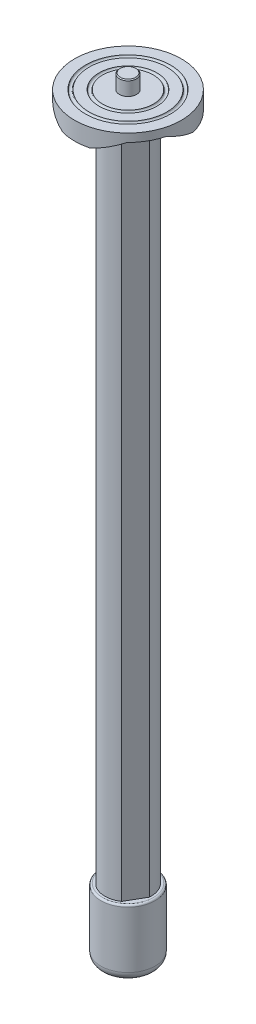
ISO-10303-21;
HEADER;
FILE_DESCRIPTION(('STEP AP214'),'2;1');
FILE_NAME('part.step','',(''),(''),'','','');
FILE_SCHEMA(('AUTOMOTIVE_DESIGN { 1 0 10303 214 1 1 1 1 }'));
ENDSEC;
DATA;
#1=APPLICATION_CONTEXT('core data for automotive mechanical design processes');
#2=APPLICATION_PROTOCOL_DEFINITION('international standard','automotive_design',2000,#1);
#3=PRODUCT_CONTEXT('',#1,'mechanical');
#4=PRODUCT('Part','Part','',(#3));
#5=PRODUCT_RELATED_PRODUCT_CATEGORY('part','',(#4));
#6=PRODUCT_DEFINITION_FORMATION('','',#4);
#7=PRODUCT_DEFINITION_CONTEXT('part definition',#1,'design');
#8=PRODUCT_DEFINITION('design','',#6,#7);
#9=PRODUCT_DEFINITION_SHAPE('','',#8);
#10=(LENGTH_UNIT() NAMED_UNIT(*) SI_UNIT(.MILLI.,.METRE.));
#11=(NAMED_UNIT(*) PLANE_ANGLE_UNIT() SI_UNIT($,.RADIAN.));
#12=(NAMED_UNIT(*) SI_UNIT($,.STERADIAN.) SOLID_ANGLE_UNIT());
#13=UNCERTAINTY_MEASURE_WITH_UNIT(LENGTH_MEASURE(1.E-05),#10,'distance_accuracy_value','');
#14=(GEOMETRIC_REPRESENTATION_CONTEXT(3) GLOBAL_UNCERTAINTY_ASSIGNED_CONTEXT((#13)) GLOBAL_UNIT_ASSIGNED_CONTEXT((#10,
#11,#12)) REPRESENTATION_CONTEXT('',''));
#15=CARTESIAN_POINT('',(0.,0.,0.));
#16=DIRECTION('',(0.,0.,1.));
#17=DIRECTION('',(1.,0.,0.));
#18=AXIS2_PLACEMENT_3D('',#15,#16,#17);
#19=CARTESIAN_POINT('',(0.,193.,0.));
#20=DIRECTION('',(0.,-1.,0.));
#21=DIRECTION('',(0.,0.,-1.));
#22=AXIS2_PLACEMENT_3D('',#19,#20,#21);
#23=CYLINDRICAL_SURFACE('',#22,12.75);
#24=DIRECTION('',(0.,-1.,0.));
#25=VECTOR('',#24,1.);
#26=CARTESIAN_POINT('',(-5.6,193.,-11.4543659798349));
#27=LINE('',#26,#25);
#28=CARTESIAN_POINT('',(-5.6,193.,-11.4543659798349));
#29=VERTEX_POINT('',#28);
#30=CARTESIAN_POINT('',(-5.6,-185.,-11.4543659798349));
#31=VERTEX_POINT('',#30);
#32=EDGE_CURVE('E116',#29,#31,#27,.T.);
#33=ORIENTED_EDGE('',*,*,#32,.T.);
#34=CARTESIAN_POINT('',(0.,-185.,0.));
#35=DIRECTION('',(0.,1.,0.));
#36=DIRECTION('',(0.,0.,1.));
#37=AXIS2_PLACEMENT_3D('',#34,#35,#36);
#38=CIRCLE('',#37,12.75);
#39=CARTESIAN_POINT('',(-12.7197719227813,-185.,0.877440728724495));
#40=VERTEX_POINT('',#39);
#41=EDGE_CURVE('E111',#31,#40,#38,.T.);
#42=ORIENTED_EDGE('',*,*,#41,.T.);
#43=DIRECTION('',(0.,-1.,0.));
#44=VECTOR('',#43,1.);
#45=CARTESIAN_POINT('',(-12.7197719227813,193.,0.877440728724491));
#46=LINE('',#45,#44);
#47=CARTESIAN_POINT('',(-12.7197719227813,193.,0.877440728724491));
#48=VERTEX_POINT('',#47);
#49=EDGE_CURVE('E13',#48,#40,#46,.T.);
#50=ORIENTED_EDGE('',*,*,#49,.F.);
#51=CARTESIAN_POINT('',(0.,193.,0.));
#52=DIRECTION('',(0.,1.,0.));
#53=DIRECTION('',(0.,0.,1.));
#54=AXIS2_PLACEMENT_3D('',#51,#52,#53);
#55=CIRCLE('',#54,12.75);
#56=EDGE_CURVE('E129',#29,#48,#55,.T.);
#57=ORIENTED_EDGE('',*,*,#56,.F.);
#58=EDGE_LOOP('',(#33,#42,#50,#57));
#59=FACE_BOUND('',#58,.T.);
#60=ADVANCED_FACE('F47',(#59),#23,.T.);
#61=CARTESIAN_POINT('',(-12.7197719227813,193.,0.877440728724491));
#62=DIRECTION('',(0.866025403784443,0.,-0.499999999999992));
#63=DIRECTION('',(-0.499999999999992,0.,-0.866025403784443));
#64=AXIS2_PLACEMENT_3D('',#61,#62,#63);
#65=PLANE('',#64);
#66=ORIENTED_EDGE('',*,*,#49,.T.);
#67=DIRECTION('',(0.499999999999992,0.,0.866025403784443));
#68=VECTOR('',#67,1.);
#69=CARTESIAN_POINT('',(-7.11977192278139,-185.,10.5769252511103));
#70=LINE('',#69,#68);
#71=CARTESIAN_POINT('',(-7.11977192278139,-185.,10.5769252511103));
#72=VERTEX_POINT('',#71);
#73=EDGE_CURVE('E101',#40,#72,#70,.T.);
#74=ORIENTED_EDGE('',*,*,#73,.T.);
#75=DIRECTION('',(0.,-1.,0.));
#76=VECTOR('',#75,1.);
#77=CARTESIAN_POINT('',(-7.11977192278139,193.,10.5769252511103));
#78=LINE('',#77,#76);
#79=CARTESIAN_POINT('',(-7.11977192278139,193.,10.5769252511103));
#80=VERTEX_POINT('',#79);
#81=EDGE_CURVE('E54',#80,#72,#78,.T.);
#82=ORIENTED_EDGE('',*,*,#81,.F.);
#83=DIRECTION('',(0.499999999999992,0.,0.866025403784443));
#84=VECTOR('',#83,1.);
#85=CARTESIAN_POINT('',(-12.7197719227813,193.,0.877440728724491));
#86=LINE('',#85,#84);
#87=EDGE_CURVE('E103',#48,#80,#86,.T.);
#88=ORIENTED_EDGE('',*,*,#87,.F.);
#89=EDGE_LOOP('',(#66,#74,#82,#88));
#90=FACE_BOUND('',#89,.T.);
#91=ADVANCED_FACE('F99',(#90),#65,.F.);
#92=CARTESIAN_POINT('',(0.,193.,0.));
#93=DIRECTION('',(0.,-1.,0.));
#94=DIRECTION('',(0.,0.,-1.));
#95=AXIS2_PLACEMENT_3D('',#92,#93,#94);
#96=CYLINDRICAL_SURFACE('',#95,12.75);
#97=ORIENTED_EDGE('',*,*,#81,.T.);
#98=CARTESIAN_POINT('',(0.,-185.,0.));
#99=DIRECTION('',(0.,1.,0.));
#100=DIRECTION('',(0.,0.,1.));
#101=AXIS2_PLACEMENT_3D('',#98,#99,#100);
#102=CIRCLE('',#101,12.75);
#103=CARTESIAN_POINT('',(7.11977192278124,-185.,10.5769252511104));
#104=VERTEX_POINT('',#103);
#105=EDGE_CURVE('E114',#72,#104,#102,.T.);
#106=ORIENTED_EDGE('',*,*,#105,.T.);
#107=DIRECTION('',(0.,-1.,0.));
#108=VECTOR('',#107,1.);
#109=CARTESIAN_POINT('',(7.11977192278124,193.,10.5769252511104));
#110=LINE('',#109,#108);
#111=CARTESIAN_POINT('',(7.11977192278124,193.,10.5769252511104));
#112=VERTEX_POINT('',#111);
#113=EDGE_CURVE('E143',#112,#104,#110,.T.);
#114=ORIENTED_EDGE('',*,*,#113,.F.);
#115=CARTESIAN_POINT('',(0.,193.,0.));
#116=DIRECTION('',(0.,1.,0.));
#117=DIRECTION('',(0.,0.,1.));
#118=AXIS2_PLACEMENT_3D('',#115,#116,#117);
#119=CIRCLE('',#118,12.75);
#120=EDGE_CURVE('E132',#80,#112,#119,.T.);
#121=ORIENTED_EDGE('',*,*,#120,.F.);
#122=EDGE_LOOP('',(#97,#106,#114,#121));
#123=FACE_BOUND('',#122,.T.);
#124=ADVANCED_FACE('F146',(#123),#96,.T.);
#125=CARTESIAN_POINT('',(7.11977192278124,193.,10.5769252511104));
#126=DIRECTION('',(-0.866025403784436,0.,-0.500000000000004));
#127=DIRECTION('',(-0.500000000000004,0.,0.866025403784436));
#128=AXIS2_PLACEMENT_3D('',#125,#126,#127);
#129=PLANE('',#128);
#130=ORIENTED_EDGE('',*,*,#113,.T.);
#131=DIRECTION('',(0.500000000000004,0.,-0.866025403784436));
#132=VECTOR('',#131,1.);
#133=CARTESIAN_POINT('',(12.7197719227813,-185.,0.87744072872467));
#134=LINE('',#133,#132);
#135=CARTESIAN_POINT('',(12.7197719227813,-185.,0.877440728724671));
#136=VERTEX_POINT('',#135);
#137=EDGE_CURVE('E121',#104,#136,#134,.T.);
#138=ORIENTED_EDGE('',*,*,#137,.T.);
#139=DIRECTION('',(0.,-1.,0.));
#140=VECTOR('',#139,1.);
#141=CARTESIAN_POINT('',(12.7197719227813,193.,0.877440728724671));
#142=LINE('',#141,#140);
#143=CARTESIAN_POINT('',(12.7197719227813,193.,0.877440728724671));
#144=VERTEX_POINT('',#143);
#145=EDGE_CURVE('E141',#144,#136,#142,.T.);
#146=ORIENTED_EDGE('',*,*,#145,.F.);
#147=DIRECTION('',(0.500000000000004,0.,-0.866025403784436));
#148=VECTOR('',#147,1.);
#149=CARTESIAN_POINT('',(7.11977192278124,193.,10.5769252511104));
#150=LINE('',#149,#148);
#151=EDGE_CURVE('E134',#112,#144,#150,.T.);
#152=ORIENTED_EDGE('',*,*,#151,.F.);
#153=EDGE_LOOP('',(#130,#138,#146,#152));
#154=FACE_BOUND('',#153,.T.);
#155=ADVANCED_FACE('F152',(#154),#129,.F.);
#156=CARTESIAN_POINT('',(0.,193.,0.));
#157=DIRECTION('',(0.,-1.,0.));
#158=DIRECTION('',(0.,0.,-1.));
#159=AXIS2_PLACEMENT_3D('',#156,#157,#158);
#160=CYLINDRICAL_SURFACE('',#159,12.75);
#161=ORIENTED_EDGE('',*,*,#145,.T.);
#162=CARTESIAN_POINT('',(0.,-185.,0.));
#163=DIRECTION('',(0.,1.,0.));
#164=DIRECTION('',(0.,0.,1.));
#165=AXIS2_PLACEMENT_3D('',#162,#163,#164);
#166=CIRCLE('',#165,12.75);
#167=CARTESIAN_POINT('',(5.6,-185.,-11.4543659798349));
#168=VERTEX_POINT('',#167);
#169=EDGE_CURVE('E124',#136,#168,#166,.T.);
#170=ORIENTED_EDGE('',*,*,#169,.T.);
#171=DIRECTION('',(0.,-1.,0.));
#172=VECTOR('',#171,1.);
#173=CARTESIAN_POINT('',(5.60000000000001,193.,-11.4543659798349));
#174=LINE('',#173,#172);
#175=CARTESIAN_POINT('',(5.60000000000001,193.,-11.4543659798349));
#176=VERTEX_POINT('',#175);
#177=EDGE_CURVE('E139',#176,#168,#174,.T.);
#178=ORIENTED_EDGE('',*,*,#177,.F.);
#179=CARTESIAN_POINT('',(0.,193.,0.));
#180=DIRECTION('',(0.,1.,0.));
#181=DIRECTION('',(0.,0.,1.));
#182=AXIS2_PLACEMENT_3D('',#179,#180,#181);
#183=CIRCLE('',#182,12.75);
#184=EDGE_CURVE('E66',#144,#176,#183,.T.);
#185=ORIENTED_EDGE('',*,*,#184,.F.);
#186=EDGE_LOOP('',(#161,#170,#178,#185));
#187=FACE_BOUND('',#186,.T.);
#188=ADVANCED_FACE('F155',(#187),#160,.T.);
#189=CARTESIAN_POINT('',(5.60000000000001,193.,-11.4543659798349));
#190=DIRECTION('',(0.,0.,1.));
#191=DIRECTION('',(1.,0.,0.));
#192=AXIS2_PLACEMENT_3D('',#189,#190,#191);
#193=PLANE('',#192);
#194=ORIENTED_EDGE('',*,*,#177,.T.);
#195=DIRECTION('',(-1.,0.,0.));
#196=VECTOR('',#195,1.);
#197=CARTESIAN_POINT('',(-5.6,-185.,-11.4543659798349));
#198=LINE('',#197,#196);
#199=EDGE_CURVE('E127',#168,#31,#198,.T.);
#200=ORIENTED_EDGE('',*,*,#199,.T.);
#201=ORIENTED_EDGE('',*,*,#32,.F.);
#202=DIRECTION('',(-1.,0.,0.));
#203=VECTOR('',#202,1.);
#204=CARTESIAN_POINT('',(5.60000000000001,193.,-11.4543659798349));
#205=LINE('',#204,#203);
#206=EDGE_CURVE('E61',#176,#29,#205,.T.);
#207=ORIENTED_EDGE('',*,*,#206,.F.);
#208=EDGE_LOOP('',(#194,#200,#201,#207));
#209=FACE_BOUND('',#208,.T.);
#210=ADVANCED_FACE('F157',(#209),#193,.F.);
#211=CARTESIAN_POINT('',(0.,193.,0.));
#212=DIRECTION('',(0.,1.,0.));
#213=DIRECTION('',(0.,0.,1.));
#214=AXIS2_PLACEMENT_3D('',#211,#212,#213);
#215=PLANE('',#214);
#216=ORIENTED_EDGE('',*,*,#56,.T.);
#217=ORIENTED_EDGE('',*,*,#87,.T.);
#218=ORIENTED_EDGE('',*,*,#120,.T.);
#219=ORIENTED_EDGE('',*,*,#151,.T.);
#220=ORIENTED_EDGE('',*,*,#184,.T.);
#221=ORIENTED_EDGE('',*,*,#206,.T.);
#222=EDGE_LOOP('',(#216,#217,#218,#219,#220,#221));
#223=FACE_BOUND('',#222,.T.);
#224=ADVANCED_FACE('F149',(#223),#215,.T.);
#225=CARTESIAN_POINT('',(0.,-185.,0.));
#226=DIRECTION('',(0.,1.,0.));
#227=DIRECTION('',(0.,0.,1.));
#228=AXIS2_PLACEMENT_3D('',#225,#226,#227);
#229=PLANE('',#228);
#230=ORIENTED_EDGE('',*,*,#41,.F.);
#231=ORIENTED_EDGE('',*,*,#199,.F.);
#232=ORIENTED_EDGE('',*,*,#169,.F.);
#233=ORIENTED_EDGE('',*,*,#137,.F.);
#234=ORIENTED_EDGE('',*,*,#105,.F.);
#235=ORIENTED_EDGE('',*,*,#73,.F.);
#236=EDGE_LOOP('',(#230,#231,#232,#233,#234,#235));
#237=FACE_BOUND('',#236,.T.);
#238=ADVANCED_FACE('F109',(#237),#229,.F.);
#239=CLOSED_SHELL('',(#60,#91,#124,#155,#188,#210,#224,#238));
#240=MANIFOLD_SOLID_BREP('B2',#239);
#241=CARTESIAN_POINT('',(0.,-200.,0.));
#242=DIRECTION('',(0.,1.,0.));
#243=DIRECTION('',(-1.,0.,0.));
#244=AXIS2_PLACEMENT_3D('',#241,#242,#243);
#245=SPHERICAL_SURFACE('',#244,25.);
#246=CARTESIAN_POINT('',(0.,-221.650635094611,0.));
#247=DIRECTION('',(0.,1.,0.));
#248=DIRECTION('',(-1.,0.,0.));
#249=AXIS2_PLACEMENT_3D('',#246,#247,#248);
#250=CIRCLE('',#249,12.5);
#251=CARTESIAN_POINT('',(-12.5,-221.650635094611,0.));
#252=VERTEX_POINT('',#251);
#253=EDGE_CURVE('E267',#252,#252,#250,.F.);
#254=ORIENTED_EDGE('',*,*,#253,.T.);
#255=EDGE_LOOP('',(#254));
#256=FACE_BOUND('',#255,.T.);
#257=ADVANCED_FACE('F256',(#256),#245,.T.);
#258=CARTESIAN_POINT('',(0.,-185.,0.));
#259=DIRECTION('',(0.,1.,0.));
#260=DIRECTION('',(-1.,0.,0.));
#261=AXIS2_PLACEMENT_3D('',#258,#259,#260);
#262=CYLINDRICAL_SURFACE('',#261,15.);
#263=CARTESIAN_POINT('',(0.,-186.,0.));
#264=DIRECTION('',(0.,-1.,0.));
#265=DIRECTION('',(1.,0.,0.));
#266=AXIS2_PLACEMENT_3D('',#263,#264,#265);
#267=CIRCLE('',#266,15.);
#268=CARTESIAN_POINT('',(15.,-186.,0.));
#269=VERTEX_POINT('',#268);
#270=EDGE_CURVE('E46',#269,#269,#267,.T.);
#271=ORIENTED_EDGE('',*,*,#270,.T.);
#272=EDGE_LOOP('',(#271));
#273=FACE_BOUND('',#272,.T.);
#274=CARTESIAN_POINT('',(0.,-217.320508075689,0.));
#275=DIRECTION('',(0.,1.,0.));
#276=DIRECTION('',(-1.,0.,0.));
#277=AXIS2_PLACEMENT_3D('',#274,#275,#276);
#278=CIRCLE('',#277,15.);
#279=CARTESIAN_POINT('',(-15.,-217.320508075689,0.));
#280=VERTEX_POINT('',#279);
#281=EDGE_CURVE('E271',#280,#280,#278,.T.);
#282=ORIENTED_EDGE('',*,*,#281,.T.);
#283=EDGE_LOOP('',(#282));
#284=FACE_BOUND('',#283,.T.);
#285=ADVANCED_FACE('F277',(#273,#284),#262,.T.);
#286=CARTESIAN_POINT('',(0.,-185.,0.));
#287=DIRECTION('',(0.,-1.,0.));
#288=DIRECTION('',(1.,0.,0.));
#289=AXIS2_PLACEMENT_3D('',#286,#287,#288);
#290=PLANE('',#289);
#291=CARTESIAN_POINT('',(0.,-185.,0.));
#292=DIRECTION('',(0.,-1.,0.));
#293=DIRECTION('',(1.,0.,0.));
#294=AXIS2_PLACEMENT_3D('',#291,#292,#293);
#295=CIRCLE('',#294,14.);
#296=CARTESIAN_POINT('',(14.,-185.,0.));
#297=VERTEX_POINT('',#296);
#298=EDGE_CURVE('E263',#297,#297,#295,.F.);
#299=ORIENTED_EDGE('',*,*,#298,.T.);
#300=EDGE_LOOP('',(#299));
#301=FACE_BOUND('',#300,.T.);
#302=ADVANCED_FACE('F281',(#301),#290,.F.);
#303=CARTESIAN_POINT('',(0.,-217.320508075689,0.));
#304=DIRECTION('',(0.,1.,0.));
#305=DIRECTION('',(-1.,0.,0.));
#306=AXIS2_PLACEMENT_3D('',#303,#304,#305);
#307=TOROIDAL_SURFACE('',#306,10.,5.);
#308=ORIENTED_EDGE('',*,*,#253,.F.);
#309=EDGE_LOOP('',(#308));
#310=FACE_BOUND('',#309,.T.);
#311=ORIENTED_EDGE('',*,*,#281,.F.);
#312=EDGE_LOOP('',(#311));
#313=FACE_BOUND('',#312,.T.);
#314=ADVANCED_FACE('F279',(#310,#313),#307,.T.);
#315=CARTESIAN_POINT('',(0.,-186.,0.));
#316=DIRECTION('',(0.,-1.,0.));
#317=DIRECTION('',(1.,0.,0.));
#318=AXIS2_PLACEMENT_3D('',#315,#316,#317);
#319=TOROIDAL_SURFACE('',#318,14.,1.);
#320=ORIENTED_EDGE('',*,*,#270,.F.);
#321=EDGE_LOOP('',(#320));
#322=FACE_BOUND('',#321,.T.);
#323=ORIENTED_EDGE('',*,*,#298,.F.);
#324=EDGE_LOOP('',(#323));
#325=FACE_BOUND('',#324,.T.);
#326=ADVANCED_FACE('F258',(#322,#325),#319,.T.);
#327=CLOSED_SHELL('',(#257,#285,#302,#314,#326));
#328=MANIFOLD_SOLID_BREP('B7',#327);
#329=CARTESIAN_POINT('',(0.,203.,0.));
#330=DIRECTION('',(0.,-1.,0.));
#331=DIRECTION('',(0.,0.,-1.));
#332=AXIS2_PLACEMENT_3D('',#329,#330,#331);
#333=CYLINDRICAL_SURFACE('',#332,4.7625);
#334=CARTESIAN_POINT('',(0.,202.5,0.));
#335=DIRECTION('',(0.,1.,0.));
#336=DIRECTION('',(0.,0.,1.));
#337=AXIS2_PLACEMENT_3D('',#334,#335,#336);
#338=CIRCLE('',#337,4.7625);
#339=CARTESIAN_POINT('',(0.,202.5,4.7625));
#340=VERTEX_POINT('',#339);
#341=EDGE_CURVE('E255',#340,#340,#338,.F.);
#342=ORIENTED_EDGE('',*,*,#341,.T.);
#343=EDGE_LOOP('',(#342));
#344=FACE_BOUND('',#343,.T.);
#345=CARTESIAN_POINT('',(0.,195.,0.));
#346=DIRECTION('',(0.,1.,0.));
#347=DIRECTION('',(0.,0.,1.));
#348=AXIS2_PLACEMENT_3D('',#345,#346,#347);
#349=CIRCLE('',#348,4.7625);
#350=CARTESIAN_POINT('',(0.,195.,4.7625));
#351=VERTEX_POINT('',#350);
#352=EDGE_CURVE('E347',#351,#351,#349,.T.);
#353=ORIENTED_EDGE('',*,*,#352,.T.);
#354=EDGE_LOOP('',(#353));
#355=FACE_BOUND('',#354,.T.);
#356=ADVANCED_FACE('F336',(#344,#355),#333,.T.);
#357=CARTESIAN_POINT('',(0.,203.,0.));
#358=DIRECTION('',(0.,1.,0.));
#359=DIRECTION('',(0.,0.,1.));
#360=AXIS2_PLACEMENT_3D('',#357,#358,#359);
#361=PLANE('',#360);
#362=CARTESIAN_POINT('',(0.,203.,0.));
#363=DIRECTION('',(0.,1.,0.));
#364=DIRECTION('',(0.,0.,1.));
#365=AXIS2_PLACEMENT_3D('',#362,#363,#364);
#366=CIRCLE('',#365,4.26249999999999);
#367=CARTESIAN_POINT('',(0.,203.,4.26249999999999));
#368=VERTEX_POINT('',#367);
#369=EDGE_CURVE('E343',#368,#368,#366,.T.);
#370=ORIENTED_EDGE('',*,*,#369,.T.);
#371=EDGE_LOOP('',(#370));
#372=FACE_BOUND('',#371,.T.);
#373=ADVANCED_FACE('F357',(#372),#361,.T.);
#374=CARTESIAN_POINT('',(0.,195.,0.));
#375=DIRECTION('',(0.,1.,0.));
#376=DIRECTION('',(0.,0.,1.));
#377=AXIS2_PLACEMENT_3D('',#374,#375,#376);
#378=PLANE('',#377);
#379=ORIENTED_EDGE('',*,*,#352,.F.);
#380=EDGE_LOOP('',(#379));
#381=FACE_BOUND('',#380,.T.);
#382=ADVANCED_FACE('F355',(#381),#378,.F.);
#383=CARTESIAN_POINT('',(0.,203.,0.));
#384=DIRECTION('',(0.,-1.,0.));
#385=DIRECTION('',(0.,0.,-1.));
#386=AXIS2_PLACEMENT_3D('',#383,#384,#385);
#387=CONICAL_SURFACE('',#386,4.26249999999999,0.785398163397454);
#388=ORIENTED_EDGE('',*,*,#341,.F.);
#389=EDGE_LOOP('',(#388));
#390=FACE_BOUND('',#389,.T.);
#391=ORIENTED_EDGE('',*,*,#369,.F.);
#392=EDGE_LOOP('',(#391));
#393=FACE_BOUND('',#392,.T.);
#394=ADVANCED_FACE('F338',(#390,#393),#387,.T.);
#395=CLOSED_SHELL('',(#356,#373,#382,#394));
#396=MANIFOLD_SOLID_BREP('B41',#395);
#397=CARTESIAN_POINT('',(0.,195.,0.));
#398=DIRECTION('',(0.,-1.,0.));
#399=DIRECTION('',(0.,0.,-1.));
#400=AXIS2_PLACEMENT_3D('',#397,#398,#399);
#401=CYLINDRICAL_SURFACE('',#400,29.5);
#402=CARTESIAN_POINT('',(0.,195.,0.));
#403=DIRECTION('',(0.,1.,0.));
#404=DIRECTION('',(0.,0.,1.));
#405=AXIS2_PLACEMENT_3D('',#402,#403,#404);
#406=CIRCLE('',#405,29.5);
#407=CARTESIAN_POINT('',(0.,195.,29.5));
#408=VERTEX_POINT('',#407);
#409=EDGE_CURVE('E334',#408,#408,#406,.T.);
#410=ORIENTED_EDGE('',*,*,#409,.F.);
#411=EDGE_LOOP('',(#410));
#412=FACE_BOUND('',#411,.T.);
#413=CARTESIAN_POINT('',(0.,193.884615384615,0.));
#414=DIRECTION('',(0.194819995418351,-0.920967251068559,-0.337438130394915));
#415=DIRECTION('',(-0.460483625534283,-0.389639990836698,0.797581035478891));
#416=AXIS2_PLACEMENT_3D('',#413,#414,#415);
#417=ELLIPSE('',#416,32.0315407152344,29.5);
#418=CARTESIAN_POINT('',(20.5903944661324,190.5,21.1254740947763));
#419=VERTEX_POINT('',#418);
#420=CARTESIAN_POINT('',(7.44261686599797,185.,28.5457081570236));
#421=VERTEX_POINT('',#420);
#422=EDGE_CURVE('E489',#419,#421,#417,.T.);
#423=ORIENTED_EDGE('',*,*,#422,.F.);
#424=CARTESIAN_POINT('',(0.,190.5,0.));
#425=DIRECTION('',(0.,-1.,0.));
#426=DIRECTION('',(0.,0.,-1.));
#427=AXIS2_PLACEMENT_3D('',#424,#425,#426);
#428=CIRCLE('',#427,29.5);
#429=CARTESIAN_POINT('',(28.5903944661325,190.5,7.26906763422531));
#430=VERTEX_POINT('',#429);
#431=EDGE_CURVE('E488',#430,#419,#428,.T.);
#432=ORIENTED_EDGE('',*,*,#431,.F.);
#433=CARTESIAN_POINT('',(0.,193.884615384615,0.));
#434=DIRECTION('',(-0.194819995418351,-0.920967251068559,0.337438130394916));
#435=DIRECTION('',(0.460483625534283,-0.389639990836698,-0.797581035478891));
#436=AXIS2_PLACEMENT_3D('',#433,#434,#435);
#437=ELLIPSE('',#436,32.0315407152344,29.5);
#438=CARTESIAN_POINT('',(28.4426168659982,185.,-7.82735880192275));
#439=VERTEX_POINT('',#438);
#440=EDGE_CURVE('E515',#439,#430,#437,.T.);
#441=ORIENTED_EDGE('',*,*,#440,.F.);
#442=CARTESIAN_POINT('',(0.,185.,0.));
#443=DIRECTION('',(0.,1.,0.));
#444=DIRECTION('',(0.,0.,1.));
#445=AXIS2_PLACEMENT_3D('',#442,#443,#444);
#446=CIRCLE('',#445,29.5);
#447=CARTESIAN_POINT('',(21.,185.,-20.7183493551007));
#448=VERTEX_POINT('',#447);
#449=EDGE_CURVE('E557',#439,#448,#446,.T.);
#450=ORIENTED_EDGE('',*,*,#449,.T.);
#451=CARTESIAN_POINT('',(0.,193.884615384615,0.));
#452=DIRECTION('',(-0.389639990836698,-0.920967251068559,0.));
#453=DIRECTION('',(0.920967251068559,-0.389639990836698,0.));
#454=AXIS2_PLACEMENT_3D('',#451,#452,#453);
#455=ELLIPSE('',#454,32.0315407152344,29.5);
#456=CARTESIAN_POINT('',(8.,190.5,-28.3945417290014));
#457=VERTEX_POINT('',#456);
#458=EDGE_CURVE('E535',#457,#448,#455,.T.);
#459=ORIENTED_EDGE('',*,*,#458,.F.);
#460=CARTESIAN_POINT('',(0.,190.5,0.));
#461=DIRECTION('',(0.,-1.,0.));
#462=DIRECTION('',(0.,0.,-1.));
#463=AXIS2_PLACEMENT_3D('',#460,#461,#462);
#464=CIRCLE('',#463,29.5);
#465=CARTESIAN_POINT('',(-8.,190.5,-28.3945417290014));
#466=VERTEX_POINT('',#465);
#467=EDGE_CURVE('E543',#466,#457,#464,.T.);
#468=ORIENTED_EDGE('',*,*,#467,.F.);
#469=CARTESIAN_POINT('',(0.,193.884615384615,0.));
#470=DIRECTION('',(0.389639990836698,-0.920967251068559,0.));
#471=DIRECTION('',(-0.920967251068559,-0.389639990836698,0.));
#472=AXIS2_PLACEMENT_3D('',#469,#470,#471);
#473=ELLIPSE('',#472,32.0315407152344,29.5);
#474=CARTESIAN_POINT('',(-21.,185.,-20.7183493551007));
#475=VERTEX_POINT('',#474);
#476=EDGE_CURVE('E541',#475,#466,#473,.T.);
#477=ORIENTED_EDGE('',*,*,#476,.F.);
#478=CARTESIAN_POINT('',(-28.442616865998,185.,-7.82735880192315));
#479=VERTEX_POINT('',#478);
#480=EDGE_CURVE('E400',#475,#479,#446,.T.);
#481=ORIENTED_EDGE('',*,*,#480,.T.);
#482=CARTESIAN_POINT('',(0.,193.884615384615,0.));
#483=DIRECTION('',(0.194819995418346,-0.920967251068559,0.337438130394918));
#484=DIRECTION('',(-0.460483625534272,-0.389639990836698,-0.797581035478897));
#485=AXIS2_PLACEMENT_3D('',#482,#483,#484);
#486=ELLIPSE('',#485,32.0315407152344,29.5);
#487=CARTESIAN_POINT('',(-28.5903944661326,190.5,7.26906763422491));
#488=VERTEX_POINT('',#487);
#489=EDGE_CURVE('E493',#488,#479,#486,.T.);
#490=ORIENTED_EDGE('',*,*,#489,.F.);
#491=CARTESIAN_POINT('',(0.,190.5,0.));
#492=DIRECTION('',(0.,-1.,0.));
#493=DIRECTION('',(0.,0.,-1.));
#494=AXIS2_PLACEMENT_3D('',#491,#492,#493);
#495=CIRCLE('',#494,29.5);
#496=CARTESIAN_POINT('',(-20.5903944661327,190.5,21.125474094776));
#497=VERTEX_POINT('',#496);
#498=EDGE_CURVE('E481',#497,#488,#495,.T.);
#499=ORIENTED_EDGE('',*,*,#498,.F.);
#500=CARTESIAN_POINT('',(0.,193.884615384615,0.));
#501=DIRECTION('',(-0.194819995418346,-0.920967251068559,-0.337438130394918));
#502=DIRECTION('',(0.460483625534272,-0.389639990836698,0.797581035478897));
#503=AXIS2_PLACEMENT_3D('',#500,#501,#502);
#504=ELLIPSE('',#503,32.0315407152344,29.5);
#505=CARTESIAN_POINT('',(-7.44261686599838,185.,28.5457081570235));
#506=VERTEX_POINT('',#505);
#507=EDGE_CURVE('E506',#506,#497,#504,.T.);
#508=ORIENTED_EDGE('',*,*,#507,.F.);
#509=EDGE_CURVE('E556',#506,#421,#446,.T.);
#510=ORIENTED_EDGE('',*,*,#509,.T.);
#511=EDGE_LOOP('',(#423,#432,#441,#450,#459,#468,#477,#481,#490,#499,#508,#510));
#512=FACE_BOUND('',#511,.T.);
#513=ADVANCED_FACE('F392',(#412,#512),#401,.T.);
#514=CARTESIAN_POINT('',(0.,185.,0.));
#515=DIRECTION('',(0.,1.,0.));
#516=DIRECTION('',(0.,0.,1.));
#517=AXIS2_PLACEMENT_3D('',#514,#515,#516);
#518=PLANE('',#517);
#519=DIRECTION('',(0.866025403784436,0.,0.500000000000004));
#520=VECTOR('',#519,1.);
#521=CARTESIAN_POINT('',(-0.107695154586859,185.,24.1865334794732));
#522=LINE('',#521,#520);
#523=CARTESIAN_POINT('',(2.02746981636743,185.,25.4192715502179));
#524=VERTEX_POINT('',#523);
#525=EDGE_CURVE('E622',#524,#421,#522,.T.);
#526=ORIENTED_EDGE('',*,*,#525,.T.);
#527=ORIENTED_EDGE('',*,*,#509,.F.);
#528=DIRECTION('',(-0.866025403784443,0.,0.499999999999992));
#529=VECTOR('',#528,1.);
#530=CARTESIAN_POINT('',(0.107695154586519,185.,24.1865334794732));
#531=LINE('',#530,#529);
#532=CARTESIAN_POINT('',(-2.0274698163678,185.,25.4192715502179));
#533=VERTEX_POINT('',#532);
#534=EDGE_CURVE('E613',#533,#506,#531,.T.);
#535=ORIENTED_EDGE('',*,*,#534,.F.);
#536=CARTESIAN_POINT('',(0.,185.,0.));
#537=DIRECTION('',(0.,-1.,0.));
#538=DIRECTION('',(0.,0.,-1.));
#539=AXIS2_PLACEMENT_3D('',#536,#537,#538);
#540=CIRCLE('',#539,25.5);
#541=EDGE_CURVE('E553',#524,#533,#540,.T.);
#542=ORIENTED_EDGE('',*,*,#541,.F.);
#543=EDGE_LOOP('',(#526,#527,#535,#542));
#544=FACE_BOUND('',#543,.T.);
#545=ADVANCED_FACE('F589',(#544),#518,.F.);
#546=DIRECTION('',(0.866025403784436,0.,0.500000000000004));
#547=VECTOR('',#546,1.);
#548=CARTESIAN_POINT('',(20.8923048454133,185.,-12.1865334794731));
#549=LINE('',#548,#547);
#550=CARTESIAN_POINT('',(23.0274698163676,185.,-10.9537954087284));
#551=VERTEX_POINT('',#550);
#552=EDGE_CURVE('E508',#551,#439,#549,.T.);
#553=ORIENTED_EDGE('',*,*,#552,.F.);
#554=CARTESIAN_POINT('',(21.,185.,-14.4654761414894));
#555=VERTEX_POINT('',#554);
#556=EDGE_CURVE('E551',#555,#551,#540,.T.);
#557=ORIENTED_EDGE('',*,*,#556,.F.);
#558=DIRECTION('',(0.,0.,-1.));
#559=VECTOR('',#558,1.);
#560=CARTESIAN_POINT('',(21.,185.,-12.));
#561=LINE('',#560,#559);
#562=EDGE_CURVE('E527',#555,#448,#561,.T.);
#563=ORIENTED_EDGE('',*,*,#562,.T.);
#564=ORIENTED_EDGE('',*,*,#449,.F.);
#565=EDGE_LOOP('',(#553,#557,#563,#564));
#566=FACE_BOUND('',#565,.T.);
#567=ADVANCED_FACE('F594',(#566),#518,.F.);
#568=DIRECTION('',(-0.866025403784443,0.,0.499999999999992));
#569=VECTOR('',#568,1.);
#570=CARTESIAN_POINT('',(-20.8923048454131,185.,-12.1865334794734));
#571=LINE('',#570,#569);
#572=CARTESIAN_POINT('',(-23.0274698163675,185.,-10.9537954087287));
#573=VERTEX_POINT('',#572);
#574=EDGE_CURVE('E498',#573,#479,#571,.T.);
#575=ORIENTED_EDGE('',*,*,#574,.T.);
#576=ORIENTED_EDGE('',*,*,#480,.F.);
#577=DIRECTION('',(0.,0.,-1.));
#578=VECTOR('',#577,1.);
#579=CARTESIAN_POINT('',(-21.,185.,-12.));
#580=LINE('',#579,#578);
#581=CARTESIAN_POINT('',(-21.,185.,-14.4654761414894));
#582=VERTEX_POINT('',#581);
#583=EDGE_CURVE('E530',#582,#475,#580,.T.);
#584=ORIENTED_EDGE('',*,*,#583,.F.);
#585=EDGE_CURVE('E545',#573,#582,#540,.T.);
#586=ORIENTED_EDGE('',*,*,#585,.F.);
#587=EDGE_LOOP('',(#575,#576,#584,#586));
#588=FACE_BOUND('',#587,.T.);
#589=ADVANCED_FACE('F596',(#588),#518,.F.);
#590=CARTESIAN_POINT('',(0.,190.5,0.));
#591=DIRECTION('',(0.,-1.,0.));
#592=DIRECTION('',(0.,0.,-1.));
#593=AXIS2_PLACEMENT_3D('',#590,#591,#592);
#594=CYLINDRICAL_SURFACE('',#593,25.5);
#595=CARTESIAN_POINT('',(0.,193.884615384615,0.));
#596=DIRECTION('',(0.194819995418351,-0.920967251068559,-0.337438130394915));
#597=DIRECTION('',(-0.460483625534283,-0.389639990836698,0.797581035478891));
#598=AXIS2_PLACEMENT_3D('',#595,#596,#597);
#599=ELLIPSE('',#598,27.6882809572365,25.5);
#600=CARTESIAN_POINT('',(16.9687267138469,190.5,19.0345032430788));
#601=VERTEX_POINT('',#600);
#602=EDGE_CURVE('E517',#524,#601,#599,.F.);
#603=ORIENTED_EDGE('',*,*,#602,.F.);
#604=ORIENTED_EDGE('',*,*,#541,.T.);
#605=CARTESIAN_POINT('',(0.,193.884615384615,0.));
#606=DIRECTION('',(-0.194819995418346,-0.920967251068559,-0.337438130394918));
#607=DIRECTION('',(0.460483625534272,-0.389639990836698,0.797581035478897));
#608=AXIS2_PLACEMENT_3D('',#605,#606,#607);
#609=ELLIPSE('',#608,27.6882809572365,25.5);
#610=CARTESIAN_POINT('',(-16.9687267138472,190.5,19.0345032430786));
#611=VERTEX_POINT('',#610);
#612=EDGE_CURVE('E504',#611,#533,#609,.F.);
#613=ORIENTED_EDGE('',*,*,#612,.F.);
#614=CARTESIAN_POINT('',(0.,190.5,0.));
#615=DIRECTION('',(0.,-1.,0.));
#616=DIRECTION('',(0.,0.,-1.));
#617=AXIS2_PLACEMENT_3D('',#614,#615,#616);
#618=CIRCLE('',#617,25.5);
#619=EDGE_CURVE('E549',#601,#611,#618,.T.);
#620=ORIENTED_EDGE('',*,*,#619,.F.);
#621=EDGE_LOOP('',(#603,#604,#613,#620));
#622=FACE_BOUND('',#621,.T.);
#623=ADVANCED_FACE('F604',(#622),#594,.F.);
#624=CARTESIAN_POINT('',(0.,193.884615384615,0.));
#625=DIRECTION('',(-0.194819995418351,-0.920967251068559,0.337438130394916));
#626=DIRECTION('',(0.460483625534283,-0.389639990836698,-0.797581035478891));
#627=AXIS2_PLACEMENT_3D('',#624,#625,#626);
#628=ELLIPSE('',#627,27.6882809572365,25.5);
#629=CARTESIAN_POINT('',(24.968726713847,190.5,5.17809678252786));
#630=VERTEX_POINT('',#629);
#631=EDGE_CURVE('E513',#630,#551,#628,.F.);
#632=ORIENTED_EDGE('',*,*,#631,.F.);
#633=CARTESIAN_POINT('',(8.,190.5,-24.2126000256065));
#634=VERTEX_POINT('',#633);
#635=EDGE_CURVE('E546',#634,#630,#618,.T.);
#636=ORIENTED_EDGE('',*,*,#635,.F.);
#637=CARTESIAN_POINT('',(0.,193.884615384615,0.));
#638=DIRECTION('',(-0.389639990836698,-0.920967251068559,0.));
#639=DIRECTION('',(0.920967251068559,-0.389639990836698,0.));
#640=AXIS2_PLACEMENT_3D('',#637,#638,#639);
#641=ELLIPSE('',#640,27.6882809572365,25.5);
#642=EDGE_CURVE('E532',#555,#634,#641,.F.);
#643=ORIENTED_EDGE('',*,*,#642,.F.);
#644=ORIENTED_EDGE('',*,*,#556,.T.);
#645=EDGE_LOOP('',(#632,#636,#643,#644));
#646=FACE_BOUND('',#645,.T.);
#647=ADVANCED_FACE('F609',(#646),#594,.F.);
#648=CARTESIAN_POINT('',(0.,193.884615384615,0.));
#649=DIRECTION('',(0.194819995418346,-0.920967251068559,0.337438130394918));
#650=DIRECTION('',(-0.460483625534272,-0.389639990836698,-0.797581035478897));
#651=AXIS2_PLACEMENT_3D('',#648,#649,#650);
#652=ELLIPSE('',#651,27.6882809572365,25.5);
#653=CARTESIAN_POINT('',(-24.968726713847,190.5,5.17809678252751));
#654=VERTEX_POINT('',#653);
#655=EDGE_CURVE('E496',#573,#654,#652,.F.);
#656=ORIENTED_EDGE('',*,*,#655,.F.);
#657=ORIENTED_EDGE('',*,*,#585,.T.);
#658=CARTESIAN_POINT('',(0.,193.884615384615,0.));
#659=DIRECTION('',(0.389639990836698,-0.920967251068559,0.));
#660=DIRECTION('',(-0.920967251068559,-0.389639990836698,0.));
#661=AXIS2_PLACEMENT_3D('',#658,#659,#660);
#662=ELLIPSE('',#661,27.6882809572365,25.5);
#663=CARTESIAN_POINT('',(-8.,190.5,-24.2126000256065));
#664=VERTEX_POINT('',#663);
#665=EDGE_CURVE('E538',#664,#582,#662,.F.);
#666=ORIENTED_EDGE('',*,*,#665,.F.);
#667=EDGE_CURVE('E550',#654,#664,#618,.T.);
#668=ORIENTED_EDGE('',*,*,#667,.F.);
#669=EDGE_LOOP('',(#656,#657,#666,#668));
#670=FACE_BOUND('',#669,.T.);
#671=ADVANCED_FACE('F584',(#670),#594,.F.);
#672=CARTESIAN_POINT('',(0.,195.,0.));
#673=DIRECTION('',(0.,1.,0.));
#674=DIRECTION('',(0.,0.,1.));
#675=AXIS2_PLACEMENT_3D('',#672,#673,#674);
#676=PLANE('',#675);
#677=ORIENTED_EDGE('',*,*,#409,.T.);
#678=EDGE_LOOP('',(#677));
#679=FACE_BOUND('',#678,.T.);
#680=CARTESIAN_POINT('',(0.,195.,0.));
#681=DIRECTION('',(0.,1.,0.));
#682=DIRECTION('',(0.,0.,1.));
#683=AXIS2_PLACEMENT_3D('',#680,#681,#682);
#684=CIRCLE('',#683,23.5);
#685=CARTESIAN_POINT('',(0.,195.,23.5));
#686=VERTEX_POINT('',#685);
#687=EDGE_CURVE('E395',#686,#686,#684,.F.);
#688=ORIENTED_EDGE('',*,*,#687,.T.);
#689=EDGE_LOOP('',(#688));
#690=FACE_BOUND('',#689,.T.);
#691=ADVANCED_FACE('F569',(#679,#690),#676,.T.);
#692=CARTESIAN_POINT('',(0.,195.,0.));
#693=DIRECTION('',(0.,1.,0.));
#694=DIRECTION('',(0.,0.,1.));
#695=AXIS2_PLACEMENT_3D('',#692,#693,#694);
#696=TOROIDAL_SURFACE('',#695,22.5,1.);
#697=ORIENTED_EDGE('',*,*,#687,.F.);
#698=EDGE_LOOP('',(#697));
#699=FACE_BOUND('',#698,.T.);
#700=CARTESIAN_POINT('',(0.,195.,0.));
#701=DIRECTION('',(0.,-1.,0.));
#702=DIRECTION('',(0.,0.,-1.));
#703=AXIS2_PLACEMENT_3D('',#700,#701,#702);
#704=CIRCLE('',#703,21.5);
#705=CARTESIAN_POINT('',(0.,195.,-21.5));
#706=VERTEX_POINT('',#705);
#707=EDGE_CURVE('E548',#706,#706,#704,.F.);
#708=ORIENTED_EDGE('',*,*,#707,.F.);
#709=EDGE_LOOP('',(#708));
#710=FACE_BOUND('',#709,.T.);
#711=ADVANCED_FACE('F571',(#699,#710),#696,.F.);
#712=CARTESIAN_POINT('',(0.,195.,0.));
#713=DIRECTION('',(0.,-1.,0.));
#714=DIRECTION('',(0.,0.,-1.));
#715=AXIS2_PLACEMENT_3D('',#712,#713,#714);
#716=CIRCLE('',#715,14.);
#717=CARTESIAN_POINT('',(0.,195.,-14.));
#718=VERTEX_POINT('',#717);
#719=EDGE_CURVE('E558',#718,#718,#716,.F.);
#720=ORIENTED_EDGE('',*,*,#719,.T.);
#721=EDGE_LOOP('',(#720));
#722=FACE_BOUND('',#721,.T.);
#723=ADVANCED_FACE('F574',(#722),#676,.T.);
#724=CARTESIAN_POINT('',(0.,195.,0.));
#725=DIRECTION('',(0.,1.,0.));
#726=DIRECTION('',(0.,0.,1.));
#727=AXIS2_PLACEMENT_3D('',#724,#725,#726);
#728=TOROIDAL_SURFACE('',#727,15.,1.);
#729=CARTESIAN_POINT('',(0.,195.,0.));
#730=DIRECTION('',(0.,1.,0.));
#731=DIRECTION('',(0.,0.,1.));
#732=AXIS2_PLACEMENT_3D('',#729,#730,#731);
#733=CIRCLE('',#732,16.);
#734=CARTESIAN_POINT('',(0.,195.,16.));
#735=VERTEX_POINT('',#734);
#736=EDGE_CURVE('E561',#735,#735,#733,.F.);
#737=ORIENTED_EDGE('',*,*,#736,.F.);
#738=EDGE_LOOP('',(#737));
#739=FACE_BOUND('',#738,.T.);
#740=ORIENTED_EDGE('',*,*,#719,.F.);
#741=EDGE_LOOP('',(#740));
#742=FACE_BOUND('',#741,.T.);
#743=ADVANCED_FACE('F580',(#739,#742),#728,.F.);
#744=ORIENTED_EDGE('',*,*,#736,.T.);
#745=EDGE_LOOP('',(#744));
#746=FACE_BOUND('',#745,.T.);
#747=ORIENTED_EDGE('',*,*,#707,.T.);
#748=EDGE_LOOP('',(#747));
#749=FACE_BOUND('',#748,.T.);
#750=ADVANCED_FACE('F583',(#746,#749),#676,.T.);
#751=CARTESIAN_POINT('',(0.,190.5,0.));
#752=DIRECTION('',(0.,-1.,0.));
#753=DIRECTION('',(0.,0.,-1.));
#754=AXIS2_PLACEMENT_3D('',#751,#752,#753);
#755=PLANE('',#754);
#756=ORIENTED_EDGE('',*,*,#635,.T.);
#757=DIRECTION('',(0.866025403784436,0.,0.500000000000004));
#758=VECTOR('',#757,1.);
#759=CARTESIAN_POINT('',(14.3923048454133,190.5,-0.928203230275445));
#760=LINE('',#759,#758);
#761=EDGE_CURVE('E615',#630,#430,#760,.T.);
#762=ORIENTED_EDGE('',*,*,#761,.T.);
#763=ORIENTED_EDGE('',*,*,#431,.T.);
#764=DIRECTION('',(0.866025403784436,0.,0.500000000000004));
#765=VECTOR('',#764,1.);
#766=CARTESIAN_POINT('',(6.3923048454132,190.5,12.9282032302755));
#767=LINE('',#766,#765);
#768=EDGE_CURVE('E415',#601,#419,#767,.T.);
#769=ORIENTED_EDGE('',*,*,#768,.F.);
#770=ORIENTED_EDGE('',*,*,#619,.T.);
#771=DIRECTION('',(-0.866025403784443,0.,0.499999999999992));
#772=VECTOR('',#771,1.);
#773=CARTESIAN_POINT('',(-6.39230484541338,190.5,12.9282032302754));
#774=LINE('',#773,#772);
#775=EDGE_CURVE('E484',#611,#497,#774,.T.);
#776=ORIENTED_EDGE('',*,*,#775,.T.);
#777=ORIENTED_EDGE('',*,*,#498,.T.);
#778=DIRECTION('',(-0.866025403784443,0.,0.499999999999992));
#779=VECTOR('',#778,1.);
#780=CARTESIAN_POINT('',(-14.3923048454133,190.5,-0.928203230275645));
#781=LINE('',#780,#779);
#782=EDGE_CURVE('E408',#654,#488,#781,.T.);
#783=ORIENTED_EDGE('',*,*,#782,.F.);
#784=ORIENTED_EDGE('',*,*,#667,.T.);
#785=DIRECTION('',(0.,0.,-1.));
#786=VECTOR('',#785,1.);
#787=CARTESIAN_POINT('',(-8.,190.5,-12.));
#788=LINE('',#787,#786);
#789=EDGE_CURVE('E521',#664,#466,#788,.T.);
#790=ORIENTED_EDGE('',*,*,#789,.T.);
#791=ORIENTED_EDGE('',*,*,#467,.T.);
#792=DIRECTION('',(0.,0.,-1.));
#793=VECTOR('',#792,1.);
#794=CARTESIAN_POINT('',(8.,190.5,-12.));
#795=LINE('',#794,#793);
#796=EDGE_CURVE('E524',#634,#457,#795,.T.);
#797=ORIENTED_EDGE('',*,*,#796,.F.);
#798=EDGE_LOOP('',(#756,#762,#763,#769,#770,#776,#777,#783,#784,#790,#791,#797));
#799=FACE_BOUND('',#798,.T.);
#800=ADVANCED_FACE('F483',(#799),#755,.T.);
#801=CARTESIAN_POINT('',(-8.,190.5,-12.));
#802=DIRECTION('',(0.389639990836698,-0.920967251068559,0.));
#803=DIRECTION('',(0.920967251068559,0.389639990836698,0.));
#804=AXIS2_PLACEMENT_3D('',#801,#802,#803);
#805=PLANE('',#804);
#806=ORIENTED_EDGE('',*,*,#476,.T.);
#807=ORIENTED_EDGE('',*,*,#789,.F.);
#808=ORIENTED_EDGE('',*,*,#665,.T.);
#809=ORIENTED_EDGE('',*,*,#583,.T.);
#810=EDGE_LOOP('',(#806,#807,#808,#809));
#811=FACE_BOUND('',#810,.T.);
#812=ADVANCED_FACE('F647',(#811),#805,.T.);
#813=CARTESIAN_POINT('',(8.,190.5,-12.));
#814=DIRECTION('',(-0.389639990836698,-0.920967251068559,0.));
#815=DIRECTION('',(0.920967251068559,-0.389639990836698,0.));
#816=AXIS2_PLACEMENT_3D('',#813,#814,#815);
#817=PLANE('',#816);
#818=ORIENTED_EDGE('',*,*,#458,.T.);
#819=ORIENTED_EDGE('',*,*,#562,.F.);
#820=ORIENTED_EDGE('',*,*,#642,.T.);
#821=ORIENTED_EDGE('',*,*,#796,.T.);
#822=EDGE_LOOP('',(#818,#819,#820,#821));
#823=FACE_BOUND('',#822,.T.);
#824=ADVANCED_FACE('F658',(#823),#817,.T.);
#825=CARTESIAN_POINT('',(-14.3923048454133,190.5,-0.928203230275645));
#826=DIRECTION('',(0.194819995418346,-0.920967251068559,0.337438130394918));
#827=DIRECTION('',(0.,-0.344030086414921,-0.938958625095559));
#828=AXIS2_PLACEMENT_3D('',#825,#826,#827);
#829=PLANE('',#828);
#830=ORIENTED_EDGE('',*,*,#489,.T.);
#831=ORIENTED_EDGE('',*,*,#574,.F.);
#832=ORIENTED_EDGE('',*,*,#655,.T.);
#833=ORIENTED_EDGE('',*,*,#782,.T.);
#834=EDGE_LOOP('',(#830,#831,#832,#833));
#835=FACE_BOUND('',#834,.T.);
#836=ADVANCED_FACE('F492',(#835),#829,.T.);
#837=CARTESIAN_POINT('',(-6.39230484541338,190.5,12.9282032302754));
#838=DIRECTION('',(-0.194819995418346,-0.920967251068559,-0.337438130394918));
#839=DIRECTION('',(0.,0.344030086414921,-0.938958625095559));
#840=AXIS2_PLACEMENT_3D('',#837,#838,#839);
#841=PLANE('',#840);
#842=ORIENTED_EDGE('',*,*,#507,.T.);
#843=ORIENTED_EDGE('',*,*,#775,.F.);
#844=ORIENTED_EDGE('',*,*,#612,.T.);
#845=ORIENTED_EDGE('',*,*,#534,.T.);
#846=EDGE_LOOP('',(#842,#843,#844,#845));
#847=FACE_BOUND('',#846,.T.);
#848=ADVANCED_FACE('F666',(#847),#841,.T.);
#849=CARTESIAN_POINT('',(6.3923048454132,190.5,12.9282032302755));
#850=DIRECTION('',(0.194819995418351,-0.920967251068559,-0.337438130394915));
#851=DIRECTION('',(0.,0.344030086414918,-0.93895862509556));
#852=AXIS2_PLACEMENT_3D('',#849,#850,#851);
#853=PLANE('',#852);
#854=ORIENTED_EDGE('',*,*,#422,.T.);
#855=ORIENTED_EDGE('',*,*,#525,.F.);
#856=ORIENTED_EDGE('',*,*,#602,.T.);
#857=ORIENTED_EDGE('',*,*,#768,.T.);
#858=EDGE_LOOP('',(#854,#855,#856,#857));
#859=FACE_BOUND('',#858,.T.);
#860=ADVANCED_FACE('F639',(#859),#853,.T.);
#861=CARTESIAN_POINT('',(14.3923048454133,190.5,-0.928203230275445));
#862=DIRECTION('',(-0.194819995418351,-0.920967251068559,0.337438130394916));
#863=DIRECTION('',(0.,-0.344030086414919,-0.93895862509556));
#864=AXIS2_PLACEMENT_3D('',#861,#862,#863);
#865=PLANE('',#864);
#866=ORIENTED_EDGE('',*,*,#440,.T.);
#867=ORIENTED_EDGE('',*,*,#761,.F.);
#868=ORIENTED_EDGE('',*,*,#631,.T.);
#869=ORIENTED_EDGE('',*,*,#552,.T.);
#870=EDGE_LOOP('',(#866,#867,#868,#869));
#871=FACE_BOUND('',#870,.T.);
#872=ADVANCED_FACE('F626',(#871),#865,.T.);
#873=CLOSED_SHELL('',(#513,#545,#567,#589,#623,#647,#671,#691,#711,#723,#743,#750,#800,#812,
#824,#836,#848,#860,#872));
#874=MANIFOLD_SOLID_BREP('B250',#873);
#875=ADVANCED_BREP_SHAPE_REPRESENTATION('',(#18,#240,#328,#396,#874),#14);
#876=SHAPE_DEFINITION_REPRESENTATION(#9,#875);
ENDSEC;
END-ISO-10303-21;
